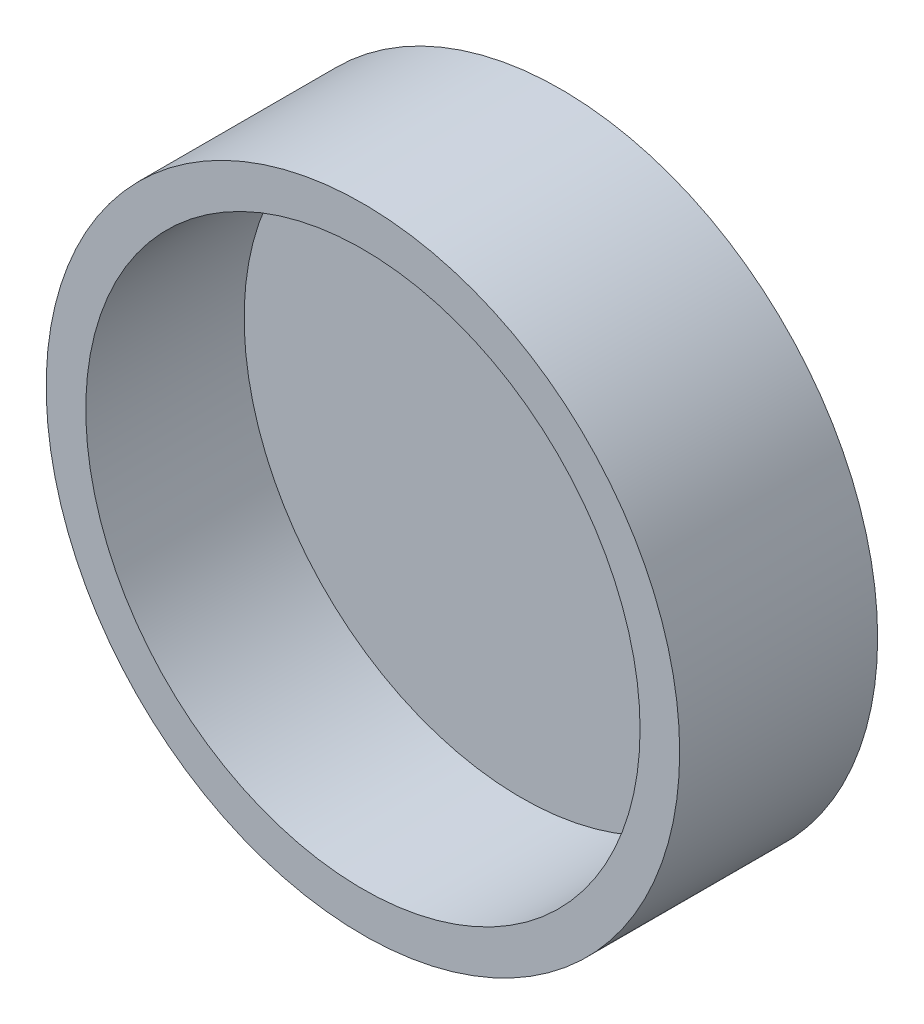
ISO-10303-21;
HEADER;
FILE_DESCRIPTION(('STEP AP214'),'2;1');
FILE_NAME('part.step','',(''),(''),'','','');
FILE_SCHEMA(('AUTOMOTIVE_DESIGN { 1 0 10303 214 1 1 1 1 }'));
ENDSEC;
DATA;
#1=APPLICATION_CONTEXT('core data for automotive mechanical design processes');
#2=APPLICATION_PROTOCOL_DEFINITION('international standard','automotive_design',2000,#1);
#3=PRODUCT_CONTEXT('',#1,'mechanical');
#4=PRODUCT('Part','Part','',(#3));
#5=PRODUCT_RELATED_PRODUCT_CATEGORY('part','',(#4));
#6=PRODUCT_DEFINITION_FORMATION('','',#4);
#7=PRODUCT_DEFINITION_CONTEXT('part definition',#1,'design');
#8=PRODUCT_DEFINITION('design','',#6,#7);
#9=PRODUCT_DEFINITION_SHAPE('','',#8);
#10=(LENGTH_UNIT() NAMED_UNIT(*) SI_UNIT(.MILLI.,.METRE.));
#11=(NAMED_UNIT(*) PLANE_ANGLE_UNIT() SI_UNIT($,.RADIAN.));
#12=(NAMED_UNIT(*) SI_UNIT($,.STERADIAN.) SOLID_ANGLE_UNIT());
#13=UNCERTAINTY_MEASURE_WITH_UNIT(LENGTH_MEASURE(1.E-05),#10,'distance_accuracy_value','');
#14=(GEOMETRIC_REPRESENTATION_CONTEXT(3) GLOBAL_UNCERTAINTY_ASSIGNED_CONTEXT((#13)) GLOBAL_UNIT_ASSIGNED_CONTEXT((#10,
#11,#12)) REPRESENTATION_CONTEXT('',''));
#15=CARTESIAN_POINT('',(0.,0.,0.));
#16=DIRECTION('',(0.,0.,1.));
#17=DIRECTION('',(1.,0.,0.));
#18=AXIS2_PLACEMENT_3D('',#15,#16,#17);
#19=CARTESIAN_POINT('',(0.,0.,20.));
#20=DIRECTION('',(0.,0.,-1.));
#21=DIRECTION('',(-1.,0.,0.));
#22=AXIS2_PLACEMENT_3D('',#19,#20,#21);
#23=CYLINDRICAL_SURFACE('',#22,40.);
#24=CARTESIAN_POINT('',(0.,0.,20.));
#25=DIRECTION('',(0.,0.,1.));
#26=DIRECTION('',(1.,0.,0.));
#27=AXIS2_PLACEMENT_3D('',#24,#25,#26);
#28=CIRCLE('',#27,40.);
#29=CARTESIAN_POINT('',(40.,0.,20.));
#30=VERTEX_POINT('',#29);
#31=EDGE_CURVE('E10',#30,#30,#28,.T.);
#32=ORIENTED_EDGE('',*,*,#31,.F.);
#33=EDGE_LOOP('',(#32));
#34=FACE_BOUND('',#33,.T.);
#35=CARTESIAN_POINT('',(0.,0.,-5.));
#36=DIRECTION('',(0.,0.,1.));
#37=DIRECTION('',(1.,0.,0.));
#38=AXIS2_PLACEMENT_3D('',#35,#36,#37);
#39=CIRCLE('',#38,40.);
#40=CARTESIAN_POINT('',(40.,0.,-5.));
#41=VERTEX_POINT('',#40);
#42=EDGE_CURVE('E39',#41,#41,#39,.T.);
#43=ORIENTED_EDGE('',*,*,#42,.T.);
#44=EDGE_LOOP('',(#43));
#45=FACE_BOUND('',#44,.T.);
#46=ADVANCED_FACE('F32',(#34,#45),#23,.T.);
#47=CARTESIAN_POINT('',(0.,0.,20.));
#48=DIRECTION('',(0.,0.,1.));
#49=DIRECTION('',(1.,0.,0.));
#50=AXIS2_PLACEMENT_3D('',#47,#48,#49);
#51=PLANE('',#50);
#52=CARTESIAN_POINT('',(0.,0.,20.));
#53=DIRECTION('',(0.,0.,1.));
#54=DIRECTION('',(1.,0.,0.));
#55=AXIS2_PLACEMENT_3D('',#52,#53,#54);
#56=CIRCLE('',#55,35.);
#57=CARTESIAN_POINT('',(35.,0.,20.));
#58=VERTEX_POINT('',#57);
#59=EDGE_CURVE('E43',#58,#58,#56,.T.);
#60=ORIENTED_EDGE('',*,*,#59,.F.);
#61=EDGE_LOOP('',(#60));
#62=FACE_BOUND('',#61,.T.);
#63=ORIENTED_EDGE('',*,*,#31,.T.);
#64=EDGE_LOOP('',(#63));
#65=FACE_BOUND('',#64,.T.);
#66=ADVANCED_FACE('F64',(#62,#65),#51,.T.);
#67=CARTESIAN_POINT('',(0.,0.,-5.));
#68=DIRECTION('',(0.,0.,1.));
#69=DIRECTION('',(1.,0.,0.));
#70=AXIS2_PLACEMENT_3D('',#67,#68,#69);
#71=PLANE('',#70);
#72=ORIENTED_EDGE('',*,*,#42,.F.);
#73=EDGE_LOOP('',(#72));
#74=FACE_BOUND('',#73,.T.);
#75=ADVANCED_FACE('F34',(#74),#71,.F.);
#76=CARTESIAN_POINT('',(0.,0.,20.));
#77=DIRECTION('',(0.,0.,-1.));
#78=DIRECTION('',(-1.,0.,0.));
#79=AXIS2_PLACEMENT_3D('',#76,#77,#78);
#80=CYLINDRICAL_SURFACE('',#79,35.);
#81=ORIENTED_EDGE('',*,*,#59,.T.);
#82=EDGE_LOOP('',(#81));
#83=FACE_BOUND('',#82,.T.);
#84=CARTESIAN_POINT('',(0.,0.,0.));
#85=DIRECTION('',(0.,0.,1.));
#86=DIRECTION('',(1.,0.,0.));
#87=AXIS2_PLACEMENT_3D('',#84,#85,#86);
#88=CIRCLE('',#87,35.);
#89=CARTESIAN_POINT('',(35.,0.,0.));
#90=VERTEX_POINT('',#89);
#91=EDGE_CURVE('E47',#90,#90,#88,.T.);
#92=ORIENTED_EDGE('',*,*,#91,.F.);
#93=EDGE_LOOP('',(#92));
#94=FACE_BOUND('',#93,.T.);
#95=ADVANCED_FACE('F55',(#83,#94),#80,.F.);
#96=CARTESIAN_POINT('',(0.,0.,0.));
#97=DIRECTION('',(0.,0.,1.));
#98=DIRECTION('',(1.,0.,0.));
#99=AXIS2_PLACEMENT_3D('',#96,#97,#98);
#100=PLANE('',#99);
#101=ORIENTED_EDGE('',*,*,#91,.T.);
#102=EDGE_LOOP('',(#101));
#103=FACE_BOUND('',#102,.T.);
#104=ADVANCED_FACE('F53',(#103),#100,.T.);
#105=CLOSED_SHELL('',(#46,#66,#75,#95,#104));
#106=MANIFOLD_SOLID_BREP('B2',#105);
#107=ADVANCED_BREP_SHAPE_REPRESENTATION('',(#18,#106),#14);
#108=SHAPE_DEFINITION_REPRESENTATION(#9,#107);
ENDSEC;
END-ISO-10303-21;
